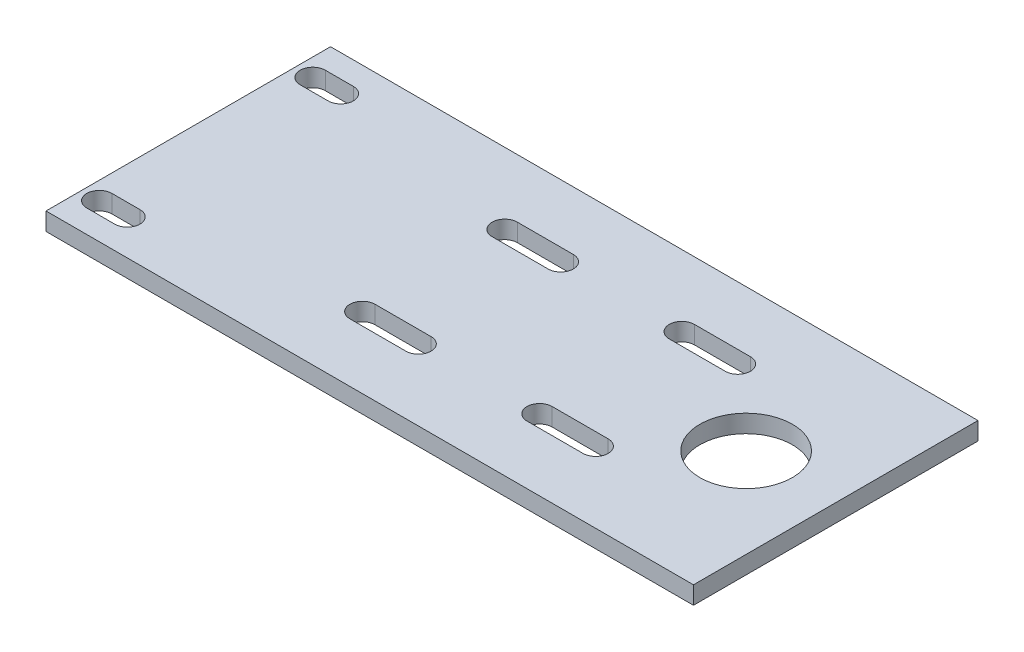
ISO-10303-21;
HEADER;
FILE_DESCRIPTION(('STEP AP214'),'2;1');
FILE_NAME('part.step','',(''),(''),'','','');
FILE_SCHEMA(('AUTOMOTIVE_DESIGN { 1 0 10303 214 1 1 1 1 }'));
ENDSEC;
DATA;
#1=APPLICATION_CONTEXT('core data for automotive mechanical design processes');
#2=APPLICATION_PROTOCOL_DEFINITION('international standard','automotive_design',2000,#1);
#3=PRODUCT_CONTEXT('',#1,'mechanical');
#4=PRODUCT('Part','Part','',(#3));
#5=PRODUCT_RELATED_PRODUCT_CATEGORY('part','',(#4));
#6=PRODUCT_DEFINITION_FORMATION('','',#4);
#7=PRODUCT_DEFINITION_CONTEXT('part definition',#1,'design');
#8=PRODUCT_DEFINITION('design','',#6,#7);
#9=PRODUCT_DEFINITION_SHAPE('','',#8);
#10=(LENGTH_UNIT() NAMED_UNIT(*) SI_UNIT(.MILLI.,.METRE.));
#11=(NAMED_UNIT(*) PLANE_ANGLE_UNIT() SI_UNIT($,.RADIAN.));
#12=(NAMED_UNIT(*) SI_UNIT($,.STERADIAN.) SOLID_ANGLE_UNIT());
#13=UNCERTAINTY_MEASURE_WITH_UNIT(LENGTH_MEASURE(1.E-05),#10,'distance_accuracy_value','');
#14=(GEOMETRIC_REPRESENTATION_CONTEXT(3) GLOBAL_UNCERTAINTY_ASSIGNED_CONTEXT((#13)) GLOBAL_UNIT_ASSIGNED_CONTEXT((#10,
#11,#12)) REPRESENTATION_CONTEXT('',''));
#15=CARTESIAN_POINT('',(0.,0.,0.));
#16=DIRECTION('',(0.,0.,1.));
#17=DIRECTION('',(1.,0.,0.));
#18=AXIS2_PLACEMENT_3D('',#15,#16,#17);
#19=CARTESIAN_POINT('',(0.,3.175,0.));
#20=DIRECTION('',(0.,0.,-1.));
#21=DIRECTION('',(-1.,0.,0.));
#22=AXIS2_PLACEMENT_3D('',#19,#20,#21);
#23=PLANE('',#22);
#24=DIRECTION('',(1.,0.,0.));
#25=VECTOR('',#24,1.);
#26=CARTESIAN_POINT('',(0.,0.,0.));
#27=LINE('',#26,#25);
#28=CARTESIAN_POINT('',(0.,0.,0.));
#29=VERTEX_POINT('',#28);
#30=CARTESIAN_POINT('',(115.6,0.,0.));
#31=VERTEX_POINT('',#30);
#32=EDGE_CURVE('E243',#29,#31,#27,.T.);
#33=ORIENTED_EDGE('',*,*,#32,.T.);
#34=DIRECTION('',(0.,1.,0.));
#35=VECTOR('',#34,1.);
#36=CARTESIAN_POINT('',(115.6,-6.825,0.));
#37=LINE('',#36,#35);
#38=CARTESIAN_POINT('',(115.6,3.175,0.));
#39=VERTEX_POINT('',#38);
#40=EDGE_CURVE('E47',#31,#39,#37,.T.);
#41=ORIENTED_EDGE('',*,*,#40,.T.);
#42=DIRECTION('',(1.,0.,0.));
#43=VECTOR('',#42,1.);
#44=CARTESIAN_POINT('',(0.,3.175,0.));
#45=LINE('',#44,#43);
#46=CARTESIAN_POINT('',(0.,3.175,0.));
#47=VERTEX_POINT('',#46);
#48=EDGE_CURVE('E230',#47,#39,#45,.T.);
#49=ORIENTED_EDGE('',*,*,#48,.F.);
#50=DIRECTION('',(0.,-1.,0.));
#51=VECTOR('',#50,1.);
#52=CARTESIAN_POINT('',(0.,3.175,0.));
#53=LINE('',#52,#51);
#54=EDGE_CURVE('E237',#47,#29,#53,.T.);
#55=ORIENTED_EDGE('',*,*,#54,.T.);
#56=EDGE_LOOP('',(#33,#41,#49,#55));
#57=FACE_BOUND('',#56,.T.);
#58=ADVANCED_FACE('F33',(#57),#23,.F.);
#59=CARTESIAN_POINT('',(0.,3.175,-50.8));
#60=DIRECTION('',(0.,0.,1.));
#61=DIRECTION('',(1.,0.,0.));
#62=AXIS2_PLACEMENT_3D('',#59,#60,#61);
#63=PLANE('',#62);
#64=DIRECTION('',(-1.,0.,0.));
#65=VECTOR('',#64,1.);
#66=CARTESIAN_POINT('',(0.,3.175,-50.8));
#67=LINE('',#66,#65);
#68=CARTESIAN_POINT('',(115.6,3.175,-50.8));
#69=VERTEX_POINT('',#68);
#70=CARTESIAN_POINT('',(0.,3.175,-50.8));
#71=VERTEX_POINT('',#70);
#72=EDGE_CURVE('E227',#69,#71,#67,.T.);
#73=ORIENTED_EDGE('',*,*,#72,.F.);
#74=DIRECTION('',(0.,1.,0.));
#75=VECTOR('',#74,1.);
#76=CARTESIAN_POINT('',(115.6,-6.825,-50.8));
#77=LINE('',#76,#75);
#78=CARTESIAN_POINT('',(115.6,0.,-50.8));
#79=VERTEX_POINT('',#78);
#80=EDGE_CURVE('E215',#79,#69,#77,.T.);
#81=ORIENTED_EDGE('',*,*,#80,.F.);
#82=DIRECTION('',(-1.,0.,0.));
#83=VECTOR('',#82,1.);
#84=CARTESIAN_POINT('',(0.,0.,-50.8));
#85=LINE('',#84,#83);
#86=CARTESIAN_POINT('',(0.,0.,-50.8));
#87=VERTEX_POINT('',#86);
#88=EDGE_CURVE('E246',#79,#87,#85,.T.);
#89=ORIENTED_EDGE('',*,*,#88,.T.);
#90=DIRECTION('',(0.,-1.,0.));
#91=VECTOR('',#90,1.);
#92=CARTESIAN_POINT('',(0.,3.175,-50.8));
#93=LINE('',#92,#91);
#94=EDGE_CURVE('E40',#71,#87,#93,.T.);
#95=ORIENTED_EDGE('',*,*,#94,.F.);
#96=EDGE_LOOP('',(#73,#81,#89,#95));
#97=FACE_BOUND('',#96,.T.);
#98=ADVANCED_FACE('F232',(#97),#63,.F.);
#99=CARTESIAN_POINT('',(0.,3.175,-50.8));
#100=DIRECTION('',(1.,0.,0.));
#101=DIRECTION('',(0.,0.,-1.));
#102=AXIS2_PLACEMENT_3D('',#99,#100,#101);
#103=PLANE('',#102);
#104=DIRECTION('',(0.,0.,1.));
#105=VECTOR('',#104,1.);
#106=CARTESIAN_POINT('',(0.,0.,-50.8));
#107=LINE('',#106,#105);
#108=EDGE_CURVE('E239',#87,#29,#107,.T.);
#109=ORIENTED_EDGE('',*,*,#108,.T.);
#110=ORIENTED_EDGE('',*,*,#54,.F.);
#111=DIRECTION('',(0.,0.,1.));
#112=VECTOR('',#111,1.);
#113=CARTESIAN_POINT('',(0.,3.175,-50.8));
#114=LINE('',#113,#112);
#115=EDGE_CURVE('E235',#71,#47,#114,.T.);
#116=ORIENTED_EDGE('',*,*,#115,.F.);
#117=ORIENTED_EDGE('',*,*,#94,.T.);
#118=EDGE_LOOP('',(#109,#110,#116,#117));
#119=FACE_BOUND('',#118,.T.);
#120=ADVANCED_FACE('F253',(#119),#103,.F.);
#121=CARTESIAN_POINT('',(0.,3.175,0.));
#122=DIRECTION('',(0.,1.,0.));
#123=DIRECTION('',(0.,0.,1.));
#124=AXIS2_PLACEMENT_3D('',#121,#122,#123);
#125=PLANE('',#124);
#126=DIRECTION('',(0.,0.,1.));
#127=VECTOR('',#126,1.);
#128=CARTESIAN_POINT('',(115.6,3.175,-50.8));
#129=LINE('',#128,#127);
#130=EDGE_CURVE('E218',#69,#39,#129,.T.);
#131=ORIENTED_EDGE('',*,*,#130,.F.);
#132=ORIENTED_EDGE('',*,*,#72,.T.);
#133=ORIENTED_EDGE('',*,*,#115,.T.);
#134=ORIENTED_EDGE('',*,*,#48,.T.);
#135=EDGE_LOOP('',(#131,#132,#133,#134));
#136=FACE_BOUND('',#135,.T.);
#137=DIRECTION('',(-1.,0.,0.));
#138=VECTOR('',#137,1.);
#139=CARTESIAN_POINT('',(80.425,3.175,-40.35));
#140=LINE('',#139,#138);
#141=CARTESIAN_POINT('',(85.425,3.175,-40.35));
#142=VERTEX_POINT('',#141);
#143=CARTESIAN_POINT('',(75.425,3.175,-40.35));
#144=VERTEX_POINT('',#143);
#145=EDGE_CURVE('E268',#142,#144,#140,.T.);
#146=ORIENTED_EDGE('',*,*,#145,.F.);
#147=CARTESIAN_POINT('',(85.425,3.175,-38.1));
#148=DIRECTION('',(0.,1.,0.));
#149=DIRECTION('',(0.,0.,1.));
#150=AXIS2_PLACEMENT_3D('',#147,#148,#149);
#151=CIRCLE('',#150,2.25);
#152=CARTESIAN_POINT('',(85.425,3.175,-35.85));
#153=VERTEX_POINT('',#152);
#154=EDGE_CURVE('E279',#153,#142,#151,.T.);
#155=ORIENTED_EDGE('',*,*,#154,.F.);
#156=DIRECTION('',(1.,0.,0.));
#157=VECTOR('',#156,1.);
#158=CARTESIAN_POINT('',(80.425,3.175,-35.85));
#159=LINE('',#158,#157);
#160=CARTESIAN_POINT('',(75.425,3.175,-35.85));
#161=VERTEX_POINT('',#160);
#162=EDGE_CURVE('E261',#161,#153,#159,.T.);
#163=ORIENTED_EDGE('',*,*,#162,.F.);
#164=CARTESIAN_POINT('',(75.425,3.175,-38.1));
#165=DIRECTION('',(0.,1.,0.));
#166=DIRECTION('',(0.,0.,1.));
#167=AXIS2_PLACEMENT_3D('',#164,#165,#166);
#168=CIRCLE('',#167,2.25);
#169=EDGE_CURVE('E259',#144,#161,#168,.T.);
#170=ORIENTED_EDGE('',*,*,#169,.F.);
#171=EDGE_LOOP('',(#146,#155,#163,#170));
#172=FACE_BOUND('',#171,.T.);
#173=DIRECTION('',(1.,0.,0.));
#174=VECTOR('',#173,1.);
#175=CARTESIAN_POINT('',(48.8,3.175,-10.45));
#176=LINE('',#175,#174);
#177=CARTESIAN_POINT('',(43.8,3.175,-10.45));
#178=VERTEX_POINT('',#177);
#179=CARTESIAN_POINT('',(53.8,3.175,-10.45));
#180=VERTEX_POINT('',#179);
#181=EDGE_CURVE('E295',#178,#180,#176,.T.);
#182=ORIENTED_EDGE('',*,*,#181,.F.);
#183=CARTESIAN_POINT('',(43.8,3.175,-12.7));
#184=DIRECTION('',(0.,1.,0.));
#185=DIRECTION('',(0.,0.,1.));
#186=AXIS2_PLACEMENT_3D('',#183,#184,#185);
#187=CIRCLE('',#186,2.25);
#188=CARTESIAN_POINT('',(43.8,3.175,-14.95));
#189=VERTEX_POINT('',#188);
#190=EDGE_CURVE('E310',#189,#178,#187,.T.);
#191=ORIENTED_EDGE('',*,*,#190,.F.);
#192=DIRECTION('',(-1.,0.,0.));
#193=VECTOR('',#192,1.);
#194=CARTESIAN_POINT('',(48.8,3.175,-14.95));
#195=LINE('',#194,#193);
#196=CARTESIAN_POINT('',(53.8,3.175,-14.95));
#197=VERTEX_POINT('',#196);
#198=EDGE_CURVE('E307',#197,#189,#195,.T.);
#199=ORIENTED_EDGE('',*,*,#198,.F.);
#200=CARTESIAN_POINT('',(53.8,3.175,-12.7));
#201=DIRECTION('',(0.,1.,0.));
#202=DIRECTION('',(0.,0.,1.));
#203=AXIS2_PLACEMENT_3D('',#200,#201,#202);
#204=CIRCLE('',#203,2.25);
#205=EDGE_CURVE('E285',#180,#197,#204,.T.);
#206=ORIENTED_EDGE('',*,*,#205,.F.);
#207=EDGE_LOOP('',(#182,#191,#199,#206));
#208=FACE_BOUND('',#207,.T.);
#209=DIRECTION('',(1.,0.,0.));
#210=VECTOR('',#209,1.);
#211=CARTESIAN_POINT('',(48.8,3.175,-35.85));
#212=LINE('',#211,#210);
#213=CARTESIAN_POINT('',(43.8,3.175,-35.85));
#214=VERTEX_POINT('',#213);
#215=CARTESIAN_POINT('',(53.8,3.175,-35.85));
#216=VERTEX_POINT('',#215);
#217=EDGE_CURVE('E327',#214,#216,#212,.T.);
#218=ORIENTED_EDGE('',*,*,#217,.F.);
#219=CARTESIAN_POINT('',(43.8,3.175,-38.1));
#220=DIRECTION('',(0.,1.,0.));
#221=DIRECTION('',(0.,0.,1.));
#222=AXIS2_PLACEMENT_3D('',#219,#220,#221);
#223=CIRCLE('',#222,2.25);
#224=CARTESIAN_POINT('',(43.8,3.175,-40.35));
#225=VERTEX_POINT('',#224);
#226=EDGE_CURVE('E342',#225,#214,#223,.T.);
#227=ORIENTED_EDGE('',*,*,#226,.F.);
#228=DIRECTION('',(-1.,0.,0.));
#229=VECTOR('',#228,1.);
#230=CARTESIAN_POINT('',(48.8,3.175,-40.35));
#231=LINE('',#230,#229);
#232=CARTESIAN_POINT('',(53.8,3.175,-40.35));
#233=VERTEX_POINT('',#232);
#234=EDGE_CURVE('E339',#233,#225,#231,.T.);
#235=ORIENTED_EDGE('',*,*,#234,.F.);
#236=CARTESIAN_POINT('',(53.8,3.175,-38.1));
#237=DIRECTION('',(0.,1.,0.));
#238=DIRECTION('',(0.,0.,1.));
#239=AXIS2_PLACEMENT_3D('',#236,#237,#238);
#240=CIRCLE('',#239,2.25);
#241=EDGE_CURVE('E317',#216,#233,#240,.T.);
#242=ORIENTED_EDGE('',*,*,#241,.F.);
#243=EDGE_LOOP('',(#218,#227,#235,#242));
#244=FACE_BOUND('',#243,.T.);
#245=CARTESIAN_POINT('',(3.175,3.175,-6.35));
#246=DIRECTION('',(0.,1.,0.));
#247=DIRECTION('',(0.,0.,1.));
#248=AXIS2_PLACEMENT_3D('',#245,#246,#247);
#249=CIRCLE('',#248,2.25);
#250=CARTESIAN_POINT('',(3.175,3.175,-8.6));
#251=VERTEX_POINT('',#250);
#252=CARTESIAN_POINT('',(3.175,3.175,-4.1));
#253=VERTEX_POINT('',#252);
#254=EDGE_CURVE('E349',#251,#253,#249,.T.);
#255=ORIENTED_EDGE('',*,*,#254,.F.);
#256=DIRECTION('',(-1.,0.,0.));
#257=VECTOR('',#256,1.);
#258=CARTESIAN_POINT('',(3.175,3.175,-8.6));
#259=LINE('',#258,#257);
#260=CARTESIAN_POINT('',(8.175,3.175,-8.6));
#261=VERTEX_POINT('',#260);
#262=EDGE_CURVE('E359',#261,#251,#259,.T.);
#263=ORIENTED_EDGE('',*,*,#262,.F.);
#264=CARTESIAN_POINT('',(8.175,3.175,-6.35));
#265=DIRECTION('',(0.,1.,0.));
#266=DIRECTION('',(0.,0.,1.));
#267=AXIS2_PLACEMENT_3D('',#264,#265,#266);
#268=CIRCLE('',#267,2.25);
#269=CARTESIAN_POINT('',(8.175,3.175,-4.1));
#270=VERTEX_POINT('',#269);
#271=EDGE_CURVE('E373',#270,#261,#268,.T.);
#272=ORIENTED_EDGE('',*,*,#271,.F.);
#273=DIRECTION('',(1.,0.,0.));
#274=VECTOR('',#273,1.);
#275=CARTESIAN_POINT('',(3.175,3.175,-4.1));
#276=LINE('',#275,#274);
#277=EDGE_CURVE('E370',#253,#270,#276,.T.);
#278=ORIENTED_EDGE('',*,*,#277,.F.);
#279=EDGE_LOOP('',(#255,#263,#272,#278));
#280=FACE_BOUND('',#279,.T.);
#281=DIRECTION('',(1.,0.,0.));
#282=VECTOR('',#281,1.);
#283=CARTESIAN_POINT('',(80.425,3.175,-10.45));
#284=LINE('',#283,#282);
#285=CARTESIAN_POINT('',(75.425,3.175,-10.45));
#286=VERTEX_POINT('',#285);
#287=CARTESIAN_POINT('',(85.425,3.175,-10.45));
#288=VERTEX_POINT('',#287);
#289=EDGE_CURVE('E391',#286,#288,#284,.T.);
#290=ORIENTED_EDGE('',*,*,#289,.F.);
#291=CARTESIAN_POINT('',(75.425,3.175,-12.7));
#292=DIRECTION('',(0.,1.,0.));
#293=DIRECTION('',(0.,0.,-1.));
#294=AXIS2_PLACEMENT_3D('',#291,#292,#293);
#295=CIRCLE('',#294,2.25);
#296=CARTESIAN_POINT('',(75.425,3.175,-14.95));
#297=VERTEX_POINT('',#296);
#298=EDGE_CURVE('E406',#297,#286,#295,.T.);
#299=ORIENTED_EDGE('',*,*,#298,.F.);
#300=DIRECTION('',(-1.,0.,0.));
#301=VECTOR('',#300,1.);
#302=CARTESIAN_POINT('',(80.425,3.175,-14.95));
#303=LINE('',#302,#301);
#304=CARTESIAN_POINT('',(85.425,3.175,-14.95));
#305=VERTEX_POINT('',#304);
#306=EDGE_CURVE('E403',#305,#297,#303,.T.);
#307=ORIENTED_EDGE('',*,*,#306,.F.);
#308=CARTESIAN_POINT('',(85.425,3.175,-12.7));
#309=DIRECTION('',(0.,1.,0.));
#310=DIRECTION('',(0.,0.,-1.));
#311=AXIS2_PLACEMENT_3D('',#308,#309,#310);
#312=CIRCLE('',#311,2.25);
#313=EDGE_CURVE('E380',#288,#305,#312,.T.);
#314=ORIENTED_EDGE('',*,*,#313,.F.);
#315=EDGE_LOOP('',(#290,#299,#307,#314));
#316=FACE_BOUND('',#315,.T.);
#317=CARTESIAN_POINT('',(3.175,3.175,-44.45));
#318=DIRECTION('',(0.,1.,0.));
#319=DIRECTION('',(0.,0.,1.));
#320=AXIS2_PLACEMENT_3D('',#317,#318,#319);
#321=CIRCLE('',#320,2.25);
#322=CARTESIAN_POINT('',(3.175,3.175,-46.7));
#323=VERTEX_POINT('',#322);
#324=CARTESIAN_POINT('',(3.175,3.175,-42.2));
#325=VERTEX_POINT('',#324);
#326=EDGE_CURVE('E413',#323,#325,#321,.T.);
#327=ORIENTED_EDGE('',*,*,#326,.F.);
#328=DIRECTION('',(-1.,0.,0.));
#329=VECTOR('',#328,1.);
#330=CARTESIAN_POINT('',(3.175,3.175,-46.7));
#331=LINE('',#330,#329);
#332=CARTESIAN_POINT('',(8.175,3.175,-46.7));
#333=VERTEX_POINT('',#332);
#334=EDGE_CURVE('E423',#333,#323,#331,.T.);
#335=ORIENTED_EDGE('',*,*,#334,.F.);
#336=CARTESIAN_POINT('',(8.175,3.175,-44.45));
#337=DIRECTION('',(0.,1.,0.));
#338=DIRECTION('',(0.,0.,1.));
#339=AXIS2_PLACEMENT_3D('',#336,#337,#338);
#340=CIRCLE('',#339,2.25);
#341=CARTESIAN_POINT('',(8.175,3.175,-42.2));
#342=VERTEX_POINT('',#341);
#343=EDGE_CURVE('E437',#342,#333,#340,.T.);
#344=ORIENTED_EDGE('',*,*,#343,.F.);
#345=DIRECTION('',(1.,0.,0.));
#346=VECTOR('',#345,1.);
#347=CARTESIAN_POINT('',(3.175,3.175,-42.2));
#348=LINE('',#347,#346);
#349=EDGE_CURVE('E434',#325,#342,#348,.T.);
#350=ORIENTED_EDGE('',*,*,#349,.F.);
#351=EDGE_LOOP('',(#327,#335,#344,#350));
#352=FACE_BOUND('',#351,.T.);
#353=CARTESIAN_POINT('',(99.6,3.175,-25.4));
#354=DIRECTION('',(0.,1.,0.));
#355=DIRECTION('',(0.,0.,1.));
#356=AXIS2_PLACEMENT_3D('',#353,#354,#355);
#357=CIRCLE('',#356,8.25500000000002);
#358=CARTESIAN_POINT('',(99.6,3.175,-17.145));
#359=VERTEX_POINT('',#358);
#360=EDGE_CURVE('E444',#359,#359,#357,.T.);
#361=ORIENTED_EDGE('',*,*,#360,.F.);
#362=EDGE_LOOP('',(#361));
#363=FACE_BOUND('',#362,.T.);
#364=ADVANCED_FACE('F225',(#136,#172,#208,#244,#280,#316,#352,#363),#125,.T.);
#365=CARTESIAN_POINT('',(0.,0.,0.));
#366=DIRECTION('',(0.,1.,0.));
#367=DIRECTION('',(0.,0.,1.));
#368=AXIS2_PLACEMENT_3D('',#365,#366,#367);
#369=PLANE('',#368);
#370=CARTESIAN_POINT('',(85.425,0.,-38.1));
#371=DIRECTION('',(0.,1.,0.));
#372=DIRECTION('',(0.,0.,1.));
#373=AXIS2_PLACEMENT_3D('',#370,#371,#372);
#374=CIRCLE('',#373,2.25);
#375=CARTESIAN_POINT('',(85.425,0.,-35.85));
#376=VERTEX_POINT('',#375);
#377=CARTESIAN_POINT('',(85.425,0.,-40.35));
#378=VERTEX_POINT('',#377);
#379=EDGE_CURVE('E274',#376,#378,#374,.T.);
#380=ORIENTED_EDGE('',*,*,#379,.T.);
#381=DIRECTION('',(-1.,0.,0.));
#382=VECTOR('',#381,1.);
#383=CARTESIAN_POINT('',(80.425,0.,-40.35));
#384=LINE('',#383,#382);
#385=CARTESIAN_POINT('',(75.425,0.,-40.35));
#386=VERTEX_POINT('',#385);
#387=EDGE_CURVE('E264',#378,#386,#384,.T.);
#388=ORIENTED_EDGE('',*,*,#387,.T.);
#389=CARTESIAN_POINT('',(75.425,0.,-38.1));
#390=DIRECTION('',(0.,1.,0.));
#391=DIRECTION('',(0.,0.,1.));
#392=AXIS2_PLACEMENT_3D('',#389,#390,#391);
#393=CIRCLE('',#392,2.25);
#394=CARTESIAN_POINT('',(75.425,0.,-35.85));
#395=VERTEX_POINT('',#394);
#396=EDGE_CURVE('E267',#386,#395,#393,.T.);
#397=ORIENTED_EDGE('',*,*,#396,.T.);
#398=DIRECTION('',(1.,0.,0.));
#399=VECTOR('',#398,1.);
#400=CARTESIAN_POINT('',(80.425,0.,-35.85));
#401=LINE('',#400,#399);
#402=EDGE_CURVE('E271',#395,#376,#401,.T.);
#403=ORIENTED_EDGE('',*,*,#402,.T.);
#404=EDGE_LOOP('',(#380,#388,#397,#403));
#405=FACE_BOUND('',#404,.T.);
#406=CARTESIAN_POINT('',(43.8,0.,-12.7));
#407=DIRECTION('',(0.,1.,0.));
#408=DIRECTION('',(0.,0.,1.));
#409=AXIS2_PLACEMENT_3D('',#406,#407,#408);
#410=CIRCLE('',#409,2.25);
#411=CARTESIAN_POINT('',(43.8,0.,-14.95));
#412=VERTEX_POINT('',#411);
#413=CARTESIAN_POINT('',(43.8,0.,-10.45));
#414=VERTEX_POINT('',#413);
#415=EDGE_CURVE('E301',#412,#414,#410,.T.);
#416=ORIENTED_EDGE('',*,*,#415,.T.);
#417=DIRECTION('',(1.,0.,0.));
#418=VECTOR('',#417,1.);
#419=CARTESIAN_POINT('',(48.8,0.,-10.45));
#420=LINE('',#419,#418);
#421=CARTESIAN_POINT('',(53.8,0.,-10.45));
#422=VERTEX_POINT('',#421);
#423=EDGE_CURVE('E291',#414,#422,#420,.T.);
#424=ORIENTED_EDGE('',*,*,#423,.T.);
#425=CARTESIAN_POINT('',(53.8,0.,-12.7));
#426=DIRECTION('',(0.,1.,0.));
#427=DIRECTION('',(0.,0.,1.));
#428=AXIS2_PLACEMENT_3D('',#425,#426,#427);
#429=CIRCLE('',#428,2.25);
#430=CARTESIAN_POINT('',(53.8,0.,-14.95));
#431=VERTEX_POINT('',#430);
#432=EDGE_CURVE('E294',#422,#431,#429,.T.);
#433=ORIENTED_EDGE('',*,*,#432,.T.);
#434=DIRECTION('',(-1.,0.,0.));
#435=VECTOR('',#434,1.);
#436=CARTESIAN_POINT('',(48.8,0.,-14.95));
#437=LINE('',#436,#435);
#438=EDGE_CURVE('E298',#431,#412,#437,.T.);
#439=ORIENTED_EDGE('',*,*,#438,.T.);
#440=EDGE_LOOP('',(#416,#424,#433,#439));
#441=FACE_BOUND('',#440,.T.);
#442=CARTESIAN_POINT('',(43.8,0.,-38.1));
#443=DIRECTION('',(0.,1.,0.));
#444=DIRECTION('',(0.,0.,1.));
#445=AXIS2_PLACEMENT_3D('',#442,#443,#444);
#446=CIRCLE('',#445,2.25);
#447=CARTESIAN_POINT('',(43.8,0.,-40.35));
#448=VERTEX_POINT('',#447);
#449=CARTESIAN_POINT('',(43.8,0.,-35.85));
#450=VERTEX_POINT('',#449);
#451=EDGE_CURVE('E333',#448,#450,#446,.T.);
#452=ORIENTED_EDGE('',*,*,#451,.T.);
#453=DIRECTION('',(1.,0.,0.));
#454=VECTOR('',#453,1.);
#455=CARTESIAN_POINT('',(48.8,0.,-35.85));
#456=LINE('',#455,#454);
#457=CARTESIAN_POINT('',(53.8,0.,-35.85));
#458=VERTEX_POINT('',#457);
#459=EDGE_CURVE('E323',#450,#458,#456,.T.);
#460=ORIENTED_EDGE('',*,*,#459,.T.);
#461=CARTESIAN_POINT('',(53.8,0.,-38.1));
#462=DIRECTION('',(0.,1.,0.));
#463=DIRECTION('',(0.,0.,1.));
#464=AXIS2_PLACEMENT_3D('',#461,#462,#463);
#465=CIRCLE('',#464,2.25);
#466=CARTESIAN_POINT('',(53.8,0.,-40.35));
#467=VERTEX_POINT('',#466);
#468=EDGE_CURVE('E326',#458,#467,#465,.T.);
#469=ORIENTED_EDGE('',*,*,#468,.T.);
#470=DIRECTION('',(-1.,0.,0.));
#471=VECTOR('',#470,1.);
#472=CARTESIAN_POINT('',(48.8,0.,-40.35));
#473=LINE('',#472,#471);
#474=EDGE_CURVE('E330',#467,#448,#473,.T.);
#475=ORIENTED_EDGE('',*,*,#474,.T.);
#476=EDGE_LOOP('',(#452,#460,#469,#475));
#477=FACE_BOUND('',#476,.T.);
#478=DIRECTION('',(-1.,0.,0.));
#479=VECTOR('',#478,1.);
#480=CARTESIAN_POINT('',(3.175,0.,-8.6));
#481=LINE('',#480,#479);
#482=CARTESIAN_POINT('',(8.175,0.,-8.6));
#483=VERTEX_POINT('',#482);
#484=CARTESIAN_POINT('',(3.175,0.,-8.6));
#485=VERTEX_POINT('',#484);
#486=EDGE_CURVE('E365',#483,#485,#481,.T.);
#487=ORIENTED_EDGE('',*,*,#486,.T.);
#488=CARTESIAN_POINT('',(3.175,0.,-6.35));
#489=DIRECTION('',(0.,1.,0.));
#490=DIRECTION('',(0.,0.,1.));
#491=AXIS2_PLACEMENT_3D('',#488,#489,#490);
#492=CIRCLE('',#491,2.25);
#493=CARTESIAN_POINT('',(3.175,0.,-4.1));
#494=VERTEX_POINT('',#493);
#495=EDGE_CURVE('E355',#485,#494,#492,.T.);
#496=ORIENTED_EDGE('',*,*,#495,.T.);
#497=DIRECTION('',(1.,0.,0.));
#498=VECTOR('',#497,1.);
#499=CARTESIAN_POINT('',(3.175,0.,-4.1));
#500=LINE('',#499,#498);
#501=CARTESIAN_POINT('',(8.175,0.,-4.1));
#502=VERTEX_POINT('',#501);
#503=EDGE_CURVE('E358',#494,#502,#500,.T.);
#504=ORIENTED_EDGE('',*,*,#503,.T.);
#505=CARTESIAN_POINT('',(8.175,0.,-6.35));
#506=DIRECTION('',(0.,1.,0.));
#507=DIRECTION('',(0.,0.,1.));
#508=AXIS2_PLACEMENT_3D('',#505,#506,#507);
#509=CIRCLE('',#508,2.25);
#510=EDGE_CURVE('E362',#502,#483,#509,.T.);
#511=ORIENTED_EDGE('',*,*,#510,.T.);
#512=EDGE_LOOP('',(#487,#496,#504,#511));
#513=FACE_BOUND('',#512,.T.);
#514=CARTESIAN_POINT('',(75.425,0.,-12.7));
#515=DIRECTION('',(0.,1.,0.));
#516=DIRECTION('',(0.,0.,-1.));
#517=AXIS2_PLACEMENT_3D('',#514,#515,#516);
#518=CIRCLE('',#517,2.25);
#519=CARTESIAN_POINT('',(75.425,0.,-14.95));
#520=VERTEX_POINT('',#519);
#521=CARTESIAN_POINT('',(75.425,0.,-10.45));
#522=VERTEX_POINT('',#521);
#523=EDGE_CURVE('E397',#520,#522,#518,.T.);
#524=ORIENTED_EDGE('',*,*,#523,.T.);
#525=DIRECTION('',(1.,0.,0.));
#526=VECTOR('',#525,1.);
#527=CARTESIAN_POINT('',(80.425,0.,-10.45));
#528=LINE('',#527,#526);
#529=CARTESIAN_POINT('',(85.425,0.,-10.45));
#530=VERTEX_POINT('',#529);
#531=EDGE_CURVE('E387',#522,#530,#528,.T.);
#532=ORIENTED_EDGE('',*,*,#531,.T.);
#533=CARTESIAN_POINT('',(85.425,0.,-12.7));
#534=DIRECTION('',(0.,1.,0.));
#535=DIRECTION('',(0.,0.,-1.));
#536=AXIS2_PLACEMENT_3D('',#533,#534,#535);
#537=CIRCLE('',#536,2.25);
#538=CARTESIAN_POINT('',(85.425,0.,-14.95));
#539=VERTEX_POINT('',#538);
#540=EDGE_CURVE('E390',#530,#539,#537,.T.);
#541=ORIENTED_EDGE('',*,*,#540,.T.);
#542=DIRECTION('',(-1.,0.,0.));
#543=VECTOR('',#542,1.);
#544=CARTESIAN_POINT('',(80.425,0.,-14.95));
#545=LINE('',#544,#543);
#546=EDGE_CURVE('E394',#539,#520,#545,.T.);
#547=ORIENTED_EDGE('',*,*,#546,.T.);
#548=EDGE_LOOP('',(#524,#532,#541,#547));
#549=FACE_BOUND('',#548,.T.);
#550=DIRECTION('',(-1.,0.,0.));
#551=VECTOR('',#550,1.);
#552=CARTESIAN_POINT('',(3.175,0.,-46.7));
#553=LINE('',#552,#551);
#554=CARTESIAN_POINT('',(8.175,0.,-46.7));
#555=VERTEX_POINT('',#554);
#556=CARTESIAN_POINT('',(3.175,0.,-46.7));
#557=VERTEX_POINT('',#556);
#558=EDGE_CURVE('E429',#555,#557,#553,.T.);
#559=ORIENTED_EDGE('',*,*,#558,.T.);
#560=CARTESIAN_POINT('',(3.175,0.,-44.45));
#561=DIRECTION('',(0.,1.,0.));
#562=DIRECTION('',(0.,0.,1.));
#563=AXIS2_PLACEMENT_3D('',#560,#561,#562);
#564=CIRCLE('',#563,2.25);
#565=CARTESIAN_POINT('',(3.175,0.,-42.2));
#566=VERTEX_POINT('',#565);
#567=EDGE_CURVE('E419',#557,#566,#564,.T.);
#568=ORIENTED_EDGE('',*,*,#567,.T.);
#569=DIRECTION('',(1.,0.,0.));
#570=VECTOR('',#569,1.);
#571=CARTESIAN_POINT('',(3.175,0.,-42.2));
#572=LINE('',#571,#570);
#573=CARTESIAN_POINT('',(8.175,0.,-42.2));
#574=VERTEX_POINT('',#573);
#575=EDGE_CURVE('E422',#566,#574,#572,.T.);
#576=ORIENTED_EDGE('',*,*,#575,.T.);
#577=CARTESIAN_POINT('',(8.175,0.,-44.45));
#578=DIRECTION('',(0.,1.,0.));
#579=DIRECTION('',(0.,0.,1.));
#580=AXIS2_PLACEMENT_3D('',#577,#578,#579);
#581=CIRCLE('',#580,2.25);
#582=EDGE_CURVE('E426',#574,#555,#581,.T.);
#583=ORIENTED_EDGE('',*,*,#582,.T.);
#584=EDGE_LOOP('',(#559,#568,#576,#583));
#585=FACE_BOUND('',#584,.T.);
#586=CARTESIAN_POINT('',(99.6,0.,-25.4));
#587=DIRECTION('',(0.,1.,0.));
#588=DIRECTION('',(0.,0.,1.));
#589=AXIS2_PLACEMENT_3D('',#586,#587,#588);
#590=CIRCLE('',#589,8.25500000000002);
#591=CARTESIAN_POINT('',(99.6,0.,-17.145));
#592=VERTEX_POINT('',#591);
#593=EDGE_CURVE('E247',#592,#592,#590,.T.);
#594=ORIENTED_EDGE('',*,*,#593,.T.);
#595=EDGE_LOOP('',(#594));
#596=FACE_BOUND('',#595,.T.);
#597=ORIENTED_EDGE('',*,*,#88,.F.);
#598=DIRECTION('',(0.,0.,1.));
#599=VECTOR('',#598,1.);
#600=CARTESIAN_POINT('',(115.6,0.,0.));
#601=LINE('',#600,#599);
#602=EDGE_CURVE('E11',#79,#31,#601,.T.);
#603=ORIENTED_EDGE('',*,*,#602,.T.);
#604=ORIENTED_EDGE('',*,*,#32,.F.);
#605=ORIENTED_EDGE('',*,*,#108,.F.);
#606=EDGE_LOOP('',(#597,#603,#604,#605));
#607=FACE_BOUND('',#606,.T.);
#608=ADVANCED_FACE('F257',(#405,#441,#477,#513,#549,#585,#596,#607),#369,.F.);
#609=CARTESIAN_POINT('',(99.6,0.,-25.4));
#610=DIRECTION('',(0.,1.,0.));
#611=DIRECTION('',(0.,0.,1.));
#612=AXIS2_PLACEMENT_3D('',#609,#610,#611);
#613=CYLINDRICAL_SURFACE('',#612,8.25500000000002);
#614=ORIENTED_EDGE('',*,*,#593,.F.);
#615=EDGE_LOOP('',(#614));
#616=FACE_BOUND('',#615,.T.);
#617=ORIENTED_EDGE('',*,*,#360,.T.);
#618=EDGE_LOOP('',(#617));
#619=FACE_BOUND('',#618,.T.);
#620=ADVANCED_FACE('F455',(#616,#619),#613,.F.);
#621=CARTESIAN_POINT('',(3.175,0.,-44.45));
#622=DIRECTION('',(0.,1.,0.));
#623=DIRECTION('',(0.,0.,1.));
#624=AXIS2_PLACEMENT_3D('',#621,#622,#623);
#625=CYLINDRICAL_SURFACE('',#624,2.25);
#626=ORIENTED_EDGE('',*,*,#326,.T.);
#627=DIRECTION('',(0.,1.,0.));
#628=VECTOR('',#627,1.);
#629=CARTESIAN_POINT('',(3.175,0.,-42.2));
#630=LINE('',#629,#628);
#631=EDGE_CURVE('E432',#566,#325,#630,.T.);
#632=ORIENTED_EDGE('',*,*,#631,.F.);
#633=ORIENTED_EDGE('',*,*,#567,.F.);
#634=DIRECTION('',(0.,1.,0.));
#635=VECTOR('',#634,1.);
#636=CARTESIAN_POINT('',(3.175,0.,-46.7));
#637=LINE('',#636,#635);
#638=EDGE_CURVE('E442',#557,#323,#637,.T.);
#639=ORIENTED_EDGE('',*,*,#638,.T.);
#640=EDGE_LOOP('',(#626,#632,#633,#639));
#641=FACE_BOUND('',#640,.T.);
#642=ADVANCED_FACE('F500',(#641),#625,.F.);
#643=CARTESIAN_POINT('',(3.175,0.,-46.7));
#644=DIRECTION('',(0.,0.,-1.));
#645=DIRECTION('',(-1.,0.,0.));
#646=AXIS2_PLACEMENT_3D('',#643,#644,#645);
#647=PLANE('',#646);
#648=ORIENTED_EDGE('',*,*,#334,.T.);
#649=ORIENTED_EDGE('',*,*,#638,.F.);
#650=ORIENTED_EDGE('',*,*,#558,.F.);
#651=DIRECTION('',(0.,1.,0.));
#652=VECTOR('',#651,1.);
#653=CARTESIAN_POINT('',(8.175,0.,-46.7));
#654=LINE('',#653,#652);
#655=EDGE_CURVE('E445',#555,#333,#654,.T.);
#656=ORIENTED_EDGE('',*,*,#655,.T.);
#657=EDGE_LOOP('',(#648,#649,#650,#656));
#658=FACE_BOUND('',#657,.T.);
#659=ADVANCED_FACE('F506',(#658),#647,.F.);
#660=CARTESIAN_POINT('',(8.175,0.,-44.45));
#661=DIRECTION('',(0.,1.,0.));
#662=DIRECTION('',(0.,0.,1.));
#663=AXIS2_PLACEMENT_3D('',#660,#661,#662);
#664=CYLINDRICAL_SURFACE('',#663,2.25);
#665=ORIENTED_EDGE('',*,*,#343,.T.);
#666=ORIENTED_EDGE('',*,*,#655,.F.);
#667=ORIENTED_EDGE('',*,*,#582,.F.);
#668=DIRECTION('',(0.,1.,0.));
#669=VECTOR('',#668,1.);
#670=CARTESIAN_POINT('',(8.175,0.,-42.2));
#671=LINE('',#670,#669);
#672=EDGE_CURVE('E447',#574,#342,#671,.T.);
#673=ORIENTED_EDGE('',*,*,#672,.T.);
#674=EDGE_LOOP('',(#665,#666,#667,#673));
#675=FACE_BOUND('',#674,.T.);
#676=ADVANCED_FACE('F514',(#675),#664,.F.);
#677=CARTESIAN_POINT('',(3.175,0.,-42.2));
#678=DIRECTION('',(0.,0.,1.));
#679=DIRECTION('',(1.,0.,0.));
#680=AXIS2_PLACEMENT_3D('',#677,#678,#679);
#681=PLANE('',#680);
#682=ORIENTED_EDGE('',*,*,#349,.T.);
#683=ORIENTED_EDGE('',*,*,#672,.F.);
#684=ORIENTED_EDGE('',*,*,#575,.F.);
#685=ORIENTED_EDGE('',*,*,#631,.T.);
#686=EDGE_LOOP('',(#682,#683,#684,#685));
#687=FACE_BOUND('',#686,.T.);
#688=ADVANCED_FACE('F522',(#687),#681,.F.);
#689=CARTESIAN_POINT('',(80.425,0.,-10.45));
#690=DIRECTION('',(0.,0.,1.));
#691=DIRECTION('',(1.,0.,0.));
#692=AXIS2_PLACEMENT_3D('',#689,#690,#691);
#693=PLANE('',#692);
#694=ORIENTED_EDGE('',*,*,#289,.T.);
#695=DIRECTION('',(0.,1.,0.));
#696=VECTOR('',#695,1.);
#697=CARTESIAN_POINT('',(85.425,0.,-10.45));
#698=LINE('',#697,#696);
#699=EDGE_CURVE('E400',#530,#288,#698,.T.);
#700=ORIENTED_EDGE('',*,*,#699,.F.);
#701=ORIENTED_EDGE('',*,*,#531,.F.);
#702=DIRECTION('',(0.,1.,0.));
#703=VECTOR('',#702,1.);
#704=CARTESIAN_POINT('',(75.425,0.,-10.45));
#705=LINE('',#704,#703);
#706=EDGE_CURVE('E411',#522,#286,#705,.T.);
#707=ORIENTED_EDGE('',*,*,#706,.T.);
#708=EDGE_LOOP('',(#694,#700,#701,#707));
#709=FACE_BOUND('',#708,.T.);
#710=ADVANCED_FACE('F530',(#709),#693,.F.);
#711=CARTESIAN_POINT('',(75.425,0.,-12.7));
#712=DIRECTION('',(0.,1.,0.));
#713=DIRECTION('',(0.,0.,1.));
#714=AXIS2_PLACEMENT_3D('',#711,#712,#713);
#715=CYLINDRICAL_SURFACE('',#714,2.25);
#716=ORIENTED_EDGE('',*,*,#298,.T.);
#717=ORIENTED_EDGE('',*,*,#706,.F.);
#718=ORIENTED_EDGE('',*,*,#523,.F.);
#719=DIRECTION('',(0.,1.,0.));
#720=VECTOR('',#719,1.);
#721=CARTESIAN_POINT('',(75.425,0.,-14.95));
#722=LINE('',#721,#720);
#723=EDGE_CURVE('E414',#520,#297,#722,.T.);
#724=ORIENTED_EDGE('',*,*,#723,.T.);
#725=EDGE_LOOP('',(#716,#717,#718,#724));
#726=FACE_BOUND('',#725,.T.);
#727=ADVANCED_FACE('F538',(#726),#715,.F.);
#728=CARTESIAN_POINT('',(80.425,0.,-14.95));
#729=DIRECTION('',(0.,0.,-1.));
#730=DIRECTION('',(-1.,0.,0.));
#731=AXIS2_PLACEMENT_3D('',#728,#729,#730);
#732=PLANE('',#731);
#733=ORIENTED_EDGE('',*,*,#306,.T.);
#734=ORIENTED_EDGE('',*,*,#723,.F.);
#735=ORIENTED_EDGE('',*,*,#546,.F.);
#736=DIRECTION('',(0.,1.,0.));
#737=VECTOR('',#736,1.);
#738=CARTESIAN_POINT('',(85.425,0.,-14.95));
#739=LINE('',#738,#737);
#740=EDGE_CURVE('E416',#539,#305,#739,.T.);
#741=ORIENTED_EDGE('',*,*,#740,.T.);
#742=EDGE_LOOP('',(#733,#734,#735,#741));
#743=FACE_BOUND('',#742,.T.);
#744=ADVANCED_FACE('F546',(#743),#732,.F.);
#745=CARTESIAN_POINT('',(85.425,0.,-12.7));
#746=DIRECTION('',(0.,1.,0.));
#747=DIRECTION('',(0.,0.,1.));
#748=AXIS2_PLACEMENT_3D('',#745,#746,#747);
#749=CYLINDRICAL_SURFACE('',#748,2.25);
#750=ORIENTED_EDGE('',*,*,#313,.T.);
#751=ORIENTED_EDGE('',*,*,#740,.F.);
#752=ORIENTED_EDGE('',*,*,#540,.F.);
#753=ORIENTED_EDGE('',*,*,#699,.T.);
#754=EDGE_LOOP('',(#750,#751,#752,#753));
#755=FACE_BOUND('',#754,.T.);
#756=ADVANCED_FACE('F554',(#755),#749,.F.);
#757=CARTESIAN_POINT('',(3.175,0.,-6.35));
#758=DIRECTION('',(0.,1.,0.));
#759=DIRECTION('',(0.,0.,1.));
#760=AXIS2_PLACEMENT_3D('',#757,#758,#759);
#761=CYLINDRICAL_SURFACE('',#760,2.25);
#762=ORIENTED_EDGE('',*,*,#254,.T.);
#763=DIRECTION('',(0.,1.,0.));
#764=VECTOR('',#763,1.);
#765=CARTESIAN_POINT('',(3.175,0.,-4.1));
#766=LINE('',#765,#764);
#767=EDGE_CURVE('E368',#494,#253,#766,.T.);
#768=ORIENTED_EDGE('',*,*,#767,.F.);
#769=ORIENTED_EDGE('',*,*,#495,.F.);
#770=DIRECTION('',(0.,1.,0.));
#771=VECTOR('',#770,1.);
#772=CARTESIAN_POINT('',(3.175,0.,-8.6));
#773=LINE('',#772,#771);
#774=EDGE_CURVE('E378',#485,#251,#773,.T.);
#775=ORIENTED_EDGE('',*,*,#774,.T.);
#776=EDGE_LOOP('',(#762,#768,#769,#775));
#777=FACE_BOUND('',#776,.T.);
#778=ADVANCED_FACE('F562',(#777),#761,.F.);
#779=CARTESIAN_POINT('',(3.175,0.,-8.6));
#780=DIRECTION('',(0.,0.,-1.));
#781=DIRECTION('',(-1.,0.,0.));
#782=AXIS2_PLACEMENT_3D('',#779,#780,#781);
#783=PLANE('',#782);
#784=ORIENTED_EDGE('',*,*,#262,.T.);
#785=ORIENTED_EDGE('',*,*,#774,.F.);
#786=ORIENTED_EDGE('',*,*,#486,.F.);
#787=DIRECTION('',(0.,1.,0.));
#788=VECTOR('',#787,1.);
#789=CARTESIAN_POINT('',(8.175,0.,-8.6));
#790=LINE('',#789,#788);
#791=EDGE_CURVE('E381',#483,#261,#790,.T.);
#792=ORIENTED_EDGE('',*,*,#791,.T.);
#793=EDGE_LOOP('',(#784,#785,#786,#792));
#794=FACE_BOUND('',#793,.T.);
#795=ADVANCED_FACE('F570',(#794),#783,.F.);
#796=CARTESIAN_POINT('',(8.175,0.,-6.35));
#797=DIRECTION('',(0.,1.,0.));
#798=DIRECTION('',(0.,0.,1.));
#799=AXIS2_PLACEMENT_3D('',#796,#797,#798);
#800=CYLINDRICAL_SURFACE('',#799,2.25);
#801=ORIENTED_EDGE('',*,*,#271,.T.);
#802=ORIENTED_EDGE('',*,*,#791,.F.);
#803=ORIENTED_EDGE('',*,*,#510,.F.);
#804=DIRECTION('',(0.,1.,0.));
#805=VECTOR('',#804,1.);
#806=CARTESIAN_POINT('',(8.175,0.,-4.1));
#807=LINE('',#806,#805);
#808=EDGE_CURVE('E383',#502,#270,#807,.T.);
#809=ORIENTED_EDGE('',*,*,#808,.T.);
#810=EDGE_LOOP('',(#801,#802,#803,#809));
#811=FACE_BOUND('',#810,.T.);
#812=ADVANCED_FACE('F578',(#811),#800,.F.);
#813=CARTESIAN_POINT('',(3.175,0.,-4.1));
#814=DIRECTION('',(0.,0.,1.));
#815=DIRECTION('',(1.,0.,0.));
#816=AXIS2_PLACEMENT_3D('',#813,#814,#815);
#817=PLANE('',#816);
#818=ORIENTED_EDGE('',*,*,#277,.T.);
#819=ORIENTED_EDGE('',*,*,#808,.F.);
#820=ORIENTED_EDGE('',*,*,#503,.F.);
#821=ORIENTED_EDGE('',*,*,#767,.T.);
#822=EDGE_LOOP('',(#818,#819,#820,#821));
#823=FACE_BOUND('',#822,.T.);
#824=ADVANCED_FACE('F586',(#823),#817,.F.);
#825=CARTESIAN_POINT('',(48.8,0.,-35.85));
#826=DIRECTION('',(0.,0.,1.));
#827=DIRECTION('',(1.,0.,0.));
#828=AXIS2_PLACEMENT_3D('',#825,#826,#827);
#829=PLANE('',#828);
#830=ORIENTED_EDGE('',*,*,#217,.T.);
#831=DIRECTION('',(0.,1.,0.));
#832=VECTOR('',#831,1.);
#833=CARTESIAN_POINT('',(53.8,0.,-35.85));
#834=LINE('',#833,#832);
#835=EDGE_CURVE('E336',#458,#216,#834,.T.);
#836=ORIENTED_EDGE('',*,*,#835,.F.);
#837=ORIENTED_EDGE('',*,*,#459,.F.);
#838=DIRECTION('',(0.,1.,0.));
#839=VECTOR('',#838,1.);
#840=CARTESIAN_POINT('',(43.8,0.,-35.85));
#841=LINE('',#840,#839);
#842=EDGE_CURVE('E347',#450,#214,#841,.T.);
#843=ORIENTED_EDGE('',*,*,#842,.T.);
#844=EDGE_LOOP('',(#830,#836,#837,#843));
#845=FACE_BOUND('',#844,.T.);
#846=ADVANCED_FACE('F594',(#845),#829,.F.);
#847=CARTESIAN_POINT('',(43.8,0.,-38.1));
#848=DIRECTION('',(0.,1.,0.));
#849=DIRECTION('',(0.,0.,1.));
#850=AXIS2_PLACEMENT_3D('',#847,#848,#849);
#851=CYLINDRICAL_SURFACE('',#850,2.25);
#852=ORIENTED_EDGE('',*,*,#226,.T.);
#853=ORIENTED_EDGE('',*,*,#842,.F.);
#854=ORIENTED_EDGE('',*,*,#451,.F.);
#855=DIRECTION('',(0.,1.,0.));
#856=VECTOR('',#855,1.);
#857=CARTESIAN_POINT('',(43.8,0.,-40.35));
#858=LINE('',#857,#856);
#859=EDGE_CURVE('E350',#448,#225,#858,.T.);
#860=ORIENTED_EDGE('',*,*,#859,.T.);
#861=EDGE_LOOP('',(#852,#853,#854,#860));
#862=FACE_BOUND('',#861,.T.);
#863=ADVANCED_FACE('F602',(#862),#851,.F.);
#864=CARTESIAN_POINT('',(48.8,0.,-40.35));
#865=DIRECTION('',(0.,0.,-1.));
#866=DIRECTION('',(-1.,0.,0.));
#867=AXIS2_PLACEMENT_3D('',#864,#865,#866);
#868=PLANE('',#867);
#869=ORIENTED_EDGE('',*,*,#234,.T.);
#870=ORIENTED_EDGE('',*,*,#859,.F.);
#871=ORIENTED_EDGE('',*,*,#474,.F.);
#872=DIRECTION('',(0.,1.,0.));
#873=VECTOR('',#872,1.);
#874=CARTESIAN_POINT('',(53.8,0.,-40.35));
#875=LINE('',#874,#873);
#876=EDGE_CURVE('E352',#467,#233,#875,.T.);
#877=ORIENTED_EDGE('',*,*,#876,.T.);
#878=EDGE_LOOP('',(#869,#870,#871,#877));
#879=FACE_BOUND('',#878,.T.);
#880=ADVANCED_FACE('F610',(#879),#868,.F.);
#881=CARTESIAN_POINT('',(53.8,0.,-38.1));
#882=DIRECTION('',(0.,1.,0.));
#883=DIRECTION('',(0.,0.,1.));
#884=AXIS2_PLACEMENT_3D('',#881,#882,#883);
#885=CYLINDRICAL_SURFACE('',#884,2.25);
#886=ORIENTED_EDGE('',*,*,#241,.T.);
#887=ORIENTED_EDGE('',*,*,#876,.F.);
#888=ORIENTED_EDGE('',*,*,#468,.F.);
#889=ORIENTED_EDGE('',*,*,#835,.T.);
#890=EDGE_LOOP('',(#886,#887,#888,#889));
#891=FACE_BOUND('',#890,.T.);
#892=ADVANCED_FACE('F618',(#891),#885,.F.);
#893=CARTESIAN_POINT('',(48.8,0.,-10.45));
#894=DIRECTION('',(0.,0.,1.));
#895=DIRECTION('',(1.,0.,0.));
#896=AXIS2_PLACEMENT_3D('',#893,#894,#895);
#897=PLANE('',#896);
#898=ORIENTED_EDGE('',*,*,#181,.T.);
#899=DIRECTION('',(0.,1.,0.));
#900=VECTOR('',#899,1.);
#901=CARTESIAN_POINT('',(53.8,0.,-10.45));
#902=LINE('',#901,#900);
#903=EDGE_CURVE('E304',#422,#180,#902,.T.);
#904=ORIENTED_EDGE('',*,*,#903,.F.);
#905=ORIENTED_EDGE('',*,*,#423,.F.);
#906=DIRECTION('',(0.,1.,0.));
#907=VECTOR('',#906,1.);
#908=CARTESIAN_POINT('',(43.8,0.,-10.45));
#909=LINE('',#908,#907);
#910=EDGE_CURVE('E315',#414,#178,#909,.T.);
#911=ORIENTED_EDGE('',*,*,#910,.T.);
#912=EDGE_LOOP('',(#898,#904,#905,#911));
#913=FACE_BOUND('',#912,.T.);
#914=ADVANCED_FACE('F626',(#913),#897,.F.);
#915=CARTESIAN_POINT('',(43.8,0.,-12.7));
#916=DIRECTION('',(0.,1.,0.));
#917=DIRECTION('',(0.,0.,1.));
#918=AXIS2_PLACEMENT_3D('',#915,#916,#917);
#919=CYLINDRICAL_SURFACE('',#918,2.25);
#920=ORIENTED_EDGE('',*,*,#190,.T.);
#921=ORIENTED_EDGE('',*,*,#910,.F.);
#922=ORIENTED_EDGE('',*,*,#415,.F.);
#923=DIRECTION('',(0.,1.,0.));
#924=VECTOR('',#923,1.);
#925=CARTESIAN_POINT('',(43.8,0.,-14.95));
#926=LINE('',#925,#924);
#927=EDGE_CURVE('E318',#412,#189,#926,.T.);
#928=ORIENTED_EDGE('',*,*,#927,.T.);
#929=EDGE_LOOP('',(#920,#921,#922,#928));
#930=FACE_BOUND('',#929,.T.);
#931=ADVANCED_FACE('F634',(#930),#919,.F.);
#932=CARTESIAN_POINT('',(48.8,0.,-14.95));
#933=DIRECTION('',(0.,0.,-1.));
#934=DIRECTION('',(-1.,0.,0.));
#935=AXIS2_PLACEMENT_3D('',#932,#933,#934);
#936=PLANE('',#935);
#937=ORIENTED_EDGE('',*,*,#198,.T.);
#938=ORIENTED_EDGE('',*,*,#927,.F.);
#939=ORIENTED_EDGE('',*,*,#438,.F.);
#940=DIRECTION('',(0.,1.,0.));
#941=VECTOR('',#940,1.);
#942=CARTESIAN_POINT('',(53.8,0.,-14.95));
#943=LINE('',#942,#941);
#944=EDGE_CURVE('E320',#431,#197,#943,.T.);
#945=ORIENTED_EDGE('',*,*,#944,.T.);
#946=EDGE_LOOP('',(#937,#938,#939,#945));
#947=FACE_BOUND('',#946,.T.);
#948=ADVANCED_FACE('F642',(#947),#936,.F.);
#949=CARTESIAN_POINT('',(53.8,0.,-12.7));
#950=DIRECTION('',(0.,1.,0.));
#951=DIRECTION('',(0.,0.,1.));
#952=AXIS2_PLACEMENT_3D('',#949,#950,#951);
#953=CYLINDRICAL_SURFACE('',#952,2.25);
#954=ORIENTED_EDGE('',*,*,#205,.T.);
#955=ORIENTED_EDGE('',*,*,#944,.F.);
#956=ORIENTED_EDGE('',*,*,#432,.F.);
#957=ORIENTED_EDGE('',*,*,#903,.T.);
#958=EDGE_LOOP('',(#954,#955,#956,#957));
#959=FACE_BOUND('',#958,.T.);
#960=ADVANCED_FACE('F650',(#959),#953,.F.);
#961=CARTESIAN_POINT('',(80.425,0.,-40.35));
#962=DIRECTION('',(0.,0.,-1.));
#963=DIRECTION('',(-1.,0.,0.));
#964=AXIS2_PLACEMENT_3D('',#961,#962,#963);
#965=PLANE('',#964);
#966=ORIENTED_EDGE('',*,*,#145,.T.);
#967=DIRECTION('',(0.,1.,0.));
#968=VECTOR('',#967,1.);
#969=CARTESIAN_POINT('',(75.425,0.,-40.35));
#970=LINE('',#969,#968);
#971=EDGE_CURVE('E54',#386,#144,#970,.T.);
#972=ORIENTED_EDGE('',*,*,#971,.F.);
#973=ORIENTED_EDGE('',*,*,#387,.F.);
#974=DIRECTION('',(0.,1.,0.));
#975=VECTOR('',#974,1.);
#976=CARTESIAN_POINT('',(85.425,0.,-40.35));
#977=LINE('',#976,#975);
#978=EDGE_CURVE('E283',#378,#142,#977,.T.);
#979=ORIENTED_EDGE('',*,*,#978,.T.);
#980=EDGE_LOOP('',(#966,#972,#973,#979));
#981=FACE_BOUND('',#980,.T.);
#982=ADVANCED_FACE('F658',(#981),#965,.F.);
#983=CARTESIAN_POINT('',(85.425,0.,-38.1));
#984=DIRECTION('',(0.,1.,0.));
#985=DIRECTION('',(0.,0.,1.));
#986=AXIS2_PLACEMENT_3D('',#983,#984,#985);
#987=CYLINDRICAL_SURFACE('',#986,2.25);
#988=ORIENTED_EDGE('',*,*,#154,.T.);
#989=ORIENTED_EDGE('',*,*,#978,.F.);
#990=ORIENTED_EDGE('',*,*,#379,.F.);
#991=DIRECTION('',(0.,1.,0.));
#992=VECTOR('',#991,1.);
#993=CARTESIAN_POINT('',(85.425,0.,-35.85));
#994=LINE('',#993,#992);
#995=EDGE_CURVE('E286',#376,#153,#994,.T.);
#996=ORIENTED_EDGE('',*,*,#995,.T.);
#997=EDGE_LOOP('',(#988,#989,#990,#996));
#998=FACE_BOUND('',#997,.T.);
#999=ADVANCED_FACE('F666',(#998),#987,.F.);
#1000=CARTESIAN_POINT('',(80.425,0.,-35.85));
#1001=DIRECTION('',(0.,0.,1.));
#1002=DIRECTION('',(1.,0.,0.));
#1003=AXIS2_PLACEMENT_3D('',#1000,#1001,#1002);
#1004=PLANE('',#1003);
#1005=ORIENTED_EDGE('',*,*,#162,.T.);
#1006=ORIENTED_EDGE('',*,*,#995,.F.);
#1007=ORIENTED_EDGE('',*,*,#402,.F.);
#1008=DIRECTION('',(0.,1.,0.));
#1009=VECTOR('',#1008,1.);
#1010=CARTESIAN_POINT('',(75.425,0.,-35.85));
#1011=LINE('',#1010,#1009);
#1012=EDGE_CURVE('E288',#395,#161,#1011,.T.);
#1013=ORIENTED_EDGE('',*,*,#1012,.T.);
#1014=EDGE_LOOP('',(#1005,#1006,#1007,#1013));
#1015=FACE_BOUND('',#1014,.T.);
#1016=ADVANCED_FACE('F674',(#1015),#1004,.F.);
#1017=CARTESIAN_POINT('',(75.425,0.,-38.1));
#1018=DIRECTION('',(0.,1.,0.));
#1019=DIRECTION('',(0.,0.,1.));
#1020=AXIS2_PLACEMENT_3D('',#1017,#1018,#1019);
#1021=CYLINDRICAL_SURFACE('',#1020,2.25);
#1022=ORIENTED_EDGE('',*,*,#169,.T.);
#1023=ORIENTED_EDGE('',*,*,#1012,.F.);
#1024=ORIENTED_EDGE('',*,*,#396,.F.);
#1025=ORIENTED_EDGE('',*,*,#971,.T.);
#1026=EDGE_LOOP('',(#1022,#1023,#1024,#1025));
#1027=FACE_BOUND('',#1026,.T.);
#1028=ADVANCED_FACE('F682',(#1027),#1021,.F.);
#1029=CARTESIAN_POINT('',(115.6,-6.825,-50.8));
#1030=DIRECTION('',(-1.,0.,0.));
#1031=DIRECTION('',(0.,0.,1.));
#1032=AXIS2_PLACEMENT_3D('',#1029,#1030,#1031);
#1033=PLANE('',#1032);
#1034=ORIENTED_EDGE('',*,*,#80,.T.);
#1035=ORIENTED_EDGE('',*,*,#130,.T.);
#1036=ORIENTED_EDGE('',*,*,#40,.F.);
#1037=ORIENTED_EDGE('',*,*,#602,.F.);
#1038=EDGE_LOOP('',(#1034,#1035,#1036,#1037));
#1039=FACE_BOUND('',#1038,.T.);
#1040=ADVANCED_FACE('F217',(#1039),#1033,.F.);
#1041=CLOSED_SHELL('',(#58,#98,#120,#364,#608,#620,#642,#659,#676,#688,#710,#727,#744,#756,#778,
#795,#812,#824,#846,#863,#880,#892,#914,#931,#948,#960,#982,#999,#1016,#1028,#1040));
#1042=MANIFOLD_SOLID_BREP('B2',#1041);
#1043=ADVANCED_BREP_SHAPE_REPRESENTATION('',(#18,#1042),#14);
#1044=SHAPE_DEFINITION_REPRESENTATION(#9,#1043);
ENDSEC;
END-ISO-10303-21;
